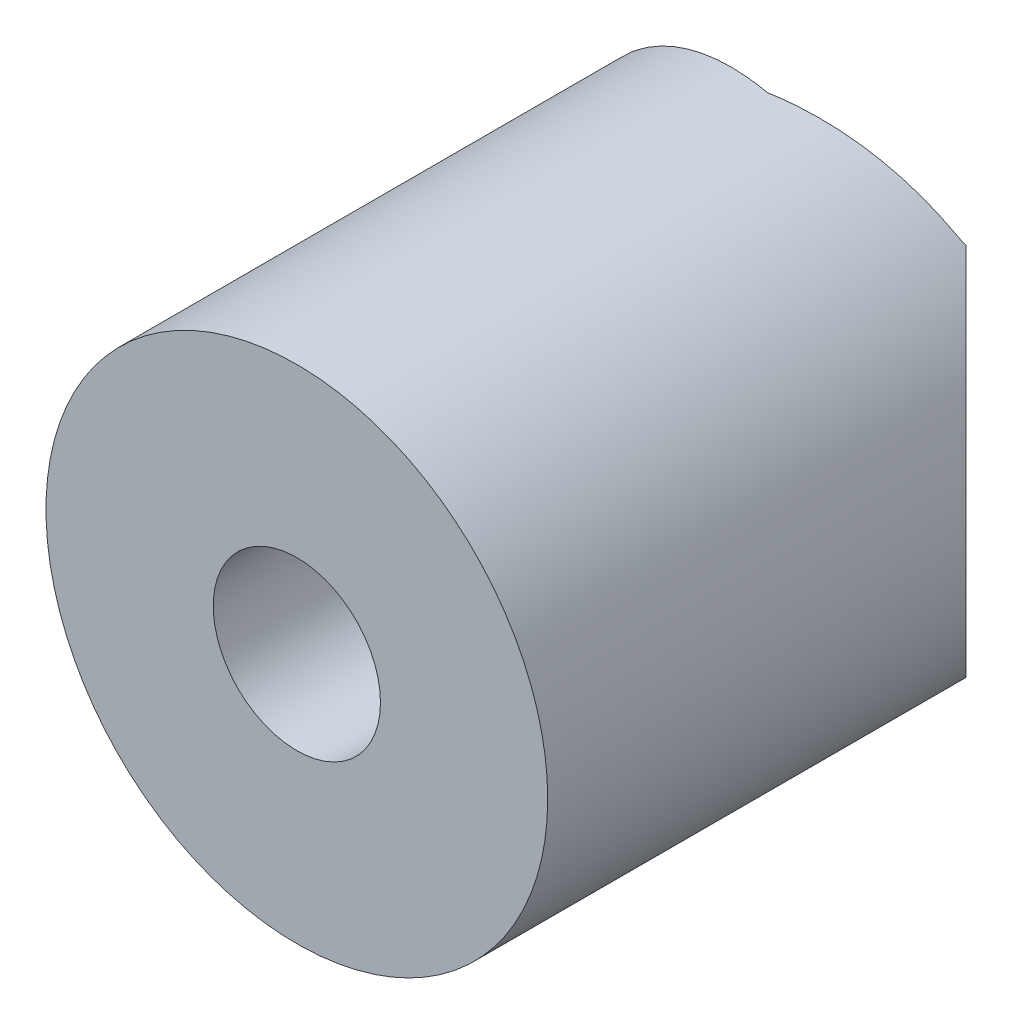
ISO-10303-21;
HEADER;
FILE_DESCRIPTION(('STEP AP214'),'2;1');
FILE_NAME('part.step','',(''),(''),'','','');
FILE_SCHEMA(('AUTOMOTIVE_DESIGN { 1 0 10303 214 1 1 1 1 }'));
ENDSEC;
DATA;
#1=APPLICATION_CONTEXT('core data for automotive mechanical design processes');
#2=APPLICATION_PROTOCOL_DEFINITION('international standard','automotive_design',2000,#1);
#3=PRODUCT_CONTEXT('',#1,'mechanical');
#4=PRODUCT('Part','Part','',(#3));
#5=PRODUCT_RELATED_PRODUCT_CATEGORY('part','',(#4));
#6=PRODUCT_DEFINITION_FORMATION('','',#4);
#7=PRODUCT_DEFINITION_CONTEXT('part definition',#1,'design');
#8=PRODUCT_DEFINITION('design','',#6,#7);
#9=PRODUCT_DEFINITION_SHAPE('','',#8);
#10=(LENGTH_UNIT() NAMED_UNIT(*) SI_UNIT(.MILLI.,.METRE.));
#11=(NAMED_UNIT(*) PLANE_ANGLE_UNIT() SI_UNIT($,.RADIAN.));
#12=(NAMED_UNIT(*) SI_UNIT($,.STERADIAN.) SOLID_ANGLE_UNIT());
#13=UNCERTAINTY_MEASURE_WITH_UNIT(LENGTH_MEASURE(1.E-05),#10,'distance_accuracy_value','');
#14=(GEOMETRIC_REPRESENTATION_CONTEXT(3) GLOBAL_UNCERTAINTY_ASSIGNED_CONTEXT((#13)) GLOBAL_UNIT_ASSIGNED_CONTEXT((#10,
#11,#12)) REPRESENTATION_CONTEXT('',''));
#15=CARTESIAN_POINT('',(0.,0.,0.));
#16=DIRECTION('',(0.,0.,1.));
#17=DIRECTION('',(1.,0.,0.));
#18=AXIS2_PLACEMENT_3D('',#15,#16,#17);
#19=CARTESIAN_POINT('',(0.,0.,-76.2));
#20=DIRECTION('',(0.,0.,1.));
#21=DIRECTION('',(1.,0.,0.));
#22=AXIS2_PLACEMENT_3D('',#19,#20,#21);
#23=CYLINDRICAL_SURFACE('',#22,38.1);
#24=CARTESIAN_POINT('',(24.3398214416335,29.3118251255257,-75.8835991586271));
#25=CARTESIAN_POINT('',(24.4311335789479,29.2360033599713,-75.9001381548973));
#26=CARTESIAN_POINT('',(24.5218196498711,29.1599773886905,-75.9191848617739));
#27=CARTESIAN_POINT('',(24.7016315526508,29.0078131129653,-75.9621877172523));
#28=CARTESIAN_POINT('',(24.7907599306828,28.9316752669905,-75.986134839524));
#29=CARTESIAN_POINT('',(24.9674825848449,28.7793055058739,-76.038893375985));
#30=CARTESIAN_POINT('',(25.0550768645508,28.7030735909518,-76.0677047788349));
#31=CARTESIAN_POINT('',(25.2287522518983,28.5505422731574,-76.1302057148872));
#32=CARTESIAN_POINT('',(25.3148302989751,28.474243001858,-76.1639040736765));
#33=CARTESIAN_POINT('',(25.4000000000001,28.3980633142472,-76.2));
#34=B_SPLINE_CURVE_WITH_KNOTS('',3,(#24,#25,#26,#27,#28,#29,#30,#31,#32,#33),.UNSPECIFIED.,.F.,
.F.,(4,2,2,2,4),(0.,0.359473855901179,0.718291443760455,1.07710819517633,1.43658121247219),.UNSPECIFIED.);
#35=CARTESIAN_POINT('',(24.3398214416335,29.3118251255257,-75.883599158627));
#36=VERTEX_POINT('',#35);
#37=CARTESIAN_POINT('',(25.4000000000001,28.3980633142472,-76.2));
#38=VERTEX_POINT('',#37);
#39=EDGE_CURVE('E203',#36,#38,#34,.T.);
#40=ORIENTED_EDGE('',*,*,#39,.F.);
#41=CARTESIAN_POINT('',(0.,0.,-71.4756));
#42=DIRECTION('',(0.178203572875659,0.,0.983993641551789));
#43=DIRECTION('',(-0.983993641551789,0.,0.178203572875659));
#44=AXIS2_PLACEMENT_3D('',#41,#42,#43);
#45=ELLIPSE('',#44,38.719762395939,38.1);
#46=CARTESIAN_POINT('',(0.,38.1,-71.4756));
#47=VERTEX_POINT('',#46);
#48=EDGE_CURVE('E194',#47,#36,#45,.F.);
#49=ORIENTED_EDGE('',*,*,#48,.F.);
#50=CARTESIAN_POINT('',(0.,0.,-71.4756));
#51=DIRECTION('',(0.178203572875659,0.,-0.983993641551789));
#52=DIRECTION('',(0.983993641551789,0.,0.178203572875659));
#53=AXIS2_PLACEMENT_3D('',#50,#51,#52);
#54=ELLIPSE('',#53,38.719762395939,38.1);
#55=CARTESIAN_POINT('',(-24.3398214416335,29.3118251255257,-75.883599158627));
#56=VERTEX_POINT('',#55);
#57=EDGE_CURVE('E182',#47,#56,#54,.F.);
#58=ORIENTED_EDGE('',*,*,#57,.T.);
#59=CARTESIAN_POINT('',(-24.3398214416335,29.3118251255257,-75.8835991586271));
#60=CARTESIAN_POINT('',(-24.4311335789479,29.2360033599713,-75.9001381548973));
#61=CARTESIAN_POINT('',(-24.5218196498711,29.1599773886905,-75.9191848617739));
#62=CARTESIAN_POINT('',(-24.7016315526508,29.0078131129653,-75.9621877172523));
#63=CARTESIAN_POINT('',(-24.7907599306828,28.9316752669906,-75.986134839524));
#64=CARTESIAN_POINT('',(-24.9674825848449,28.7793055058739,-76.038893375985));
#65=CARTESIAN_POINT('',(-25.0550768645508,28.7030735909518,-76.0677047788349));
#66=CARTESIAN_POINT('',(-25.2287522518983,28.5505422731574,-76.1302057148872));
#67=CARTESIAN_POINT('',(-25.3148302989751,28.474243001858,-76.1639040736765));
#68=CARTESIAN_POINT('',(-25.4000000000001,28.3980633142472,-76.2));
#69=B_SPLINE_CURVE_WITH_KNOTS('',3,(#59,#60,#61,#62,#63,#64,#65,#66,#67,#68),.UNSPECIFIED.,.F.,
.F.,(4,2,2,2,4),(0.,0.359473855901172,0.71829144376045,1.07710819517633,1.43658121247218),.UNSPECIFIED.);
#70=CARTESIAN_POINT('',(-25.4000000000001,28.3980633142472,-76.2));
#71=VERTEX_POINT('',#70);
#72=EDGE_CURVE('E325',#56,#71,#69,.T.);
#73=ORIENTED_EDGE('',*,*,#72,.T.);
#74=CARTESIAN_POINT('',(0.,0.,-101.6));
#75=DIRECTION('',(-0.707106781186552,0.,-0.707106781186544));
#76=DIRECTION('',(-0.707106781186544,0.,0.707106781186552));
#77=AXIS2_PLACEMENT_3D('',#74,#75,#76);
#78=ELLIPSE('',#77,53.8815367264152,38.1);
#79=CARTESIAN_POINT('',(-25.4000000000001,-28.3980633142472,-76.2));
#80=VERTEX_POINT('',#79);
#81=EDGE_CURVE('E207',#71,#80,#78,.F.);
#82=ORIENTED_EDGE('',*,*,#81,.T.);
#83=CARTESIAN_POINT('',(-25.4000000000002,-28.3980633142472,-76.2));
#84=CARTESIAN_POINT('',(-25.3148302989751,-28.474243001858,-76.1639040736765));
#85=CARTESIAN_POINT('',(-25.2287522518983,-28.5505422731574,-76.1302057148872));
#86=CARTESIAN_POINT('',(-25.0550768645508,-28.7030735909518,-76.0677047788349));
#87=CARTESIAN_POINT('',(-24.9674825848449,-28.7793055058739,-76.038893375985));
#88=CARTESIAN_POINT('',(-24.7907599306828,-28.9316752669905,-75.986134839524));
#89=CARTESIAN_POINT('',(-24.7016315526508,-29.0078131129653,-75.9621877172523));
#90=CARTESIAN_POINT('',(-24.5218196498711,-29.1599773886905,-75.9191848617739));
#91=CARTESIAN_POINT('',(-24.4311335789479,-29.2360033599713,-75.9001381548973));
#92=CARTESIAN_POINT('',(-24.3398214416335,-29.3118251255257,-75.8835991586271));
#93=B_SPLINE_CURVE_WITH_KNOTS('',3,(#83,#84,#85,#86,#87,#88,#89,#90,#91,#92),.UNSPECIFIED.,.F.,
.F.,(4,2,2,2,4),(0.,0.359473017295866,0.718289768711761,1.07710735657105,1.43658121247224),.UNSPECIFIED.);
#94=CARTESIAN_POINT('',(-24.3398214416335,-29.3118251255257,-75.883599158627));
#95=VERTEX_POINT('',#94);
#96=EDGE_CURVE('E152',#80,#95,#93,.T.);
#97=ORIENTED_EDGE('',*,*,#96,.T.);
#98=CARTESIAN_POINT('',(0.,-38.1,-71.4756));
#99=VERTEX_POINT('',#98);
#100=EDGE_CURVE('E189',#95,#99,#54,.F.);
#101=ORIENTED_EDGE('',*,*,#100,.T.);
#102=CARTESIAN_POINT('',(24.3398214416335,-29.3118251255257,-75.883599158627));
#103=VERTEX_POINT('',#102);
#104=EDGE_CURVE('E188',#103,#99,#45,.F.);
#105=ORIENTED_EDGE('',*,*,#104,.F.);
#106=CARTESIAN_POINT('',(25.4000000000002,-28.3980633142472,-76.2));
#107=CARTESIAN_POINT('',(25.3148302989751,-28.474243001858,-76.1639040736765));
#108=CARTESIAN_POINT('',(25.2287522518983,-28.5505422731574,-76.1302057148872));
#109=CARTESIAN_POINT('',(25.0550768645508,-28.7030735909518,-76.0677047788349));
#110=CARTESIAN_POINT('',(24.9674825848449,-28.7793055058739,-76.038893375985));
#111=CARTESIAN_POINT('',(24.7907599306828,-28.9316752669905,-75.986134839524));
#112=CARTESIAN_POINT('',(24.7016315526508,-29.0078131129653,-75.9621877172523));
#113=CARTESIAN_POINT('',(24.5218196498711,-29.1599773886905,-75.9191848617739));
#114=CARTESIAN_POINT('',(24.4311335789479,-29.2360033599713,-75.9001381548973));
#115=CARTESIAN_POINT('',(24.3398214416335,-29.3118251255257,-75.8835991586271));
#116=B_SPLINE_CURVE_WITH_KNOTS('',3,(#106,#107,#108,#109,#110,#111,#112,#113,#114,#115),
.UNSPECIFIED.,.F.,.F.,(4,2,2,2,4),(0.,0.359473017295866,0.718289768711761,1.07710735657105,
1.43658121247224),.UNSPECIFIED.);
#117=CARTESIAN_POINT('',(25.4000000000001,-28.3980633142472,-76.2));
#118=VERTEX_POINT('',#117);
#119=EDGE_CURVE('E319',#118,#103,#116,.T.);
#120=ORIENTED_EDGE('',*,*,#119,.F.);
#121=CARTESIAN_POINT('',(0.,0.,-101.6));
#122=DIRECTION('',(-0.707106781186552,0.,0.707106781186544));
#123=DIRECTION('',(0.707106781186544,0.,0.707106781186552));
#124=AXIS2_PLACEMENT_3D('',#121,#122,#123);
#125=ELLIPSE('',#124,53.8815367264152,38.1);
#126=EDGE_CURVE('E204',#38,#118,#125,.F.);
#127=ORIENTED_EDGE('',*,*,#126,.F.);
#128=EDGE_LOOP('',(#40,#49,#58,#73,#82,#97,#101,#105,#120,#127));
#129=FACE_BOUND('',#128,.T.);
#130=CARTESIAN_POINT('',(0.,0.,0.));
#131=DIRECTION('',(0.,0.,1.));
#132=DIRECTION('',(1.,0.,0.));
#133=AXIS2_PLACEMENT_3D('',#130,#131,#132);
#134=CIRCLE('',#133,38.1);
#135=CARTESIAN_POINT('',(38.1,0.,0.));
#136=VERTEX_POINT('',#135);
#137=EDGE_CURVE('E215',#136,#136,#134,.T.);
#138=ORIENTED_EDGE('',*,*,#137,.F.);
#139=EDGE_LOOP('',(#138));
#140=FACE_BOUND('',#139,.T.);
#141=ADVANCED_FACE('F129',(#129,#140),#23,.T.);
#142=CARTESIAN_POINT('',(0.,0.,0.));
#143=DIRECTION('',(0.,0.,1.));
#144=DIRECTION('',(1.,0.,0.));
#145=AXIS2_PLACEMENT_3D('',#142,#143,#144);
#146=PLANE('',#145);
#147=CARTESIAN_POINT('',(0.,0.,0.));
#148=DIRECTION('',(0.,0.,1.));
#149=DIRECTION('',(1.,0.,0.));
#150=AXIS2_PLACEMENT_3D('',#147,#148,#149);
#151=CIRCLE('',#150,12.7);
#152=CARTESIAN_POINT('',(12.7,0.,0.));
#153=VERTEX_POINT('',#152);
#154=EDGE_CURVE('E212',#153,#153,#151,.T.);
#155=ORIENTED_EDGE('',*,*,#154,.F.);
#156=EDGE_LOOP('',(#155));
#157=FACE_BOUND('',#156,.T.);
#158=ORIENTED_EDGE('',*,*,#137,.T.);
#159=EDGE_LOOP('',(#158));
#160=FACE_BOUND('',#159,.T.);
#161=ADVANCED_FACE('F231',(#157,#160),#146,.T.);
#162=CARTESIAN_POINT('',(0.,0.,-76.2));
#163=DIRECTION('',(0.,0.,1.));
#164=DIRECTION('',(1.,0.,0.));
#165=AXIS2_PLACEMENT_3D('',#162,#163,#164);
#166=CYLINDRICAL_SURFACE('',#165,12.7);
#167=CARTESIAN_POINT('',(0.,0.,-71.4756));
#168=DIRECTION('',(0.178203572875659,0.,-0.983993641551789));
#169=DIRECTION('',(0.983993641551789,0.,0.178203572875659));
#170=AXIS2_PLACEMENT_3D('',#167,#168,#169);
#171=ELLIPSE('',#170,12.906587465313,12.7);
#172=CARTESIAN_POINT('',(0.,12.7,-71.4756));
#173=VERTEX_POINT('',#172);
#174=CARTESIAN_POINT('',(0.,-12.7,-71.4756));
#175=VERTEX_POINT('',#174);
#176=EDGE_CURVE('E137',#173,#175,#171,.F.);
#177=ORIENTED_EDGE('',*,*,#176,.F.);
#178=CARTESIAN_POINT('',(0.,0.,-71.4756));
#179=DIRECTION('',(0.178203572875659,0.,0.983993641551789));
#180=DIRECTION('',(-0.983993641551789,0.,0.178203572875659));
#181=AXIS2_PLACEMENT_3D('',#178,#179,#180);
#182=ELLIPSE('',#181,12.906587465313,12.7);
#183=EDGE_CURVE('E12',#173,#175,#182,.F.);
#184=ORIENTED_EDGE('',*,*,#183,.T.);
#185=EDGE_LOOP('',(#177,#184));
#186=FACE_BOUND('',#185,.T.);
#187=ORIENTED_EDGE('',*,*,#154,.T.);
#188=EDGE_LOOP('',(#187));
#189=FACE_BOUND('',#188,.T.);
#190=ADVANCED_FACE('F227',(#186,#189),#166,.F.);
#191=CARTESIAN_POINT('',(50.8000000000002,-38.1,-50.7999999999996));
#192=DIRECTION('',(-0.707106781186552,0.,0.707106781186544));
#193=DIRECTION('',(0.707106781186544,0.,0.707106781186552));
#194=AXIS2_PLACEMENT_3D('',#191,#192,#193);
#195=PLANE('',#194);
#196=ORIENTED_EDGE('',*,*,#126,.T.);
#197=DIRECTION('',(0.,-1.,0.));
#198=VECTOR('',#197,1.);
#199=CARTESIAN_POINT('',(25.4000000000001,0.,-76.2));
#200=LINE('',#199,#198);
#201=EDGE_CURVE('E218',#38,#118,#200,.T.);
#202=ORIENTED_EDGE('',*,*,#201,.F.);
#203=EDGE_LOOP('',(#196,#202));
#204=FACE_BOUND('',#203,.T.);
#205=ADVANCED_FACE('F230',(#204),#195,.F.);
#206=CARTESIAN_POINT('',(-50.8000000000002,-38.1,-50.7999999999996));
#207=DIRECTION('',(-0.707106781186552,0.,-0.707106781186544));
#208=DIRECTION('',(-0.707106781186544,0.,0.707106781186552));
#209=AXIS2_PLACEMENT_3D('',#206,#207,#208);
#210=PLANE('',#209);
#211=ORIENTED_EDGE('',*,*,#81,.F.);
#212=DIRECTION('',(0.,-1.,0.));
#213=VECTOR('',#212,1.);
#214=CARTESIAN_POINT('',(-25.4000000000001,0.,-76.2));
#215=LINE('',#214,#213);
#216=EDGE_CURVE('E220',#71,#80,#215,.T.);
#217=ORIENTED_EDGE('',*,*,#216,.T.);
#218=EDGE_LOOP('',(#211,#217));
#219=FACE_BOUND('',#218,.T.);
#220=ADVANCED_FACE('F255',(#219),#210,.T.);
#221=CARTESIAN_POINT('',(-12.5333309878636,-38.1,-69.2057841518526));
#222=DIRECTION('',(0.178203572875659,0.,0.983993641551789));
#223=DIRECTION('',(0.983993641551789,0.,-0.178203572875659));
#224=AXIS2_PLACEMENT_3D('',#221,#222,#223);
#225=PLANE('',#224);
#226=ORIENTED_EDGE('',*,*,#48,.T.);
#227=DIRECTION('',(0.,1.,0.));
#228=VECTOR('',#227,1.);
#229=CARTESIAN_POINT('',(24.3398214416335,-38.1,-75.883599158627));
#230=LINE('',#229,#228);
#231=EDGE_CURVE('E226',#103,#36,#230,.T.);
#232=ORIENTED_EDGE('',*,*,#231,.F.);
#233=ORIENTED_EDGE('',*,*,#104,.T.);
#234=DIRECTION('',(0.,1.,0.));
#235=VECTOR('',#234,1.);
#236=CARTESIAN_POINT('',(0.,-38.1,-71.4756));
#237=LINE('',#236,#235);
#238=EDGE_CURVE('E198',#99,#175,#237,.T.);
#239=ORIENTED_EDGE('',*,*,#238,.T.);
#240=ORIENTED_EDGE('',*,*,#183,.F.);
#241=EDGE_CURVE('E144',#173,#47,#237,.T.);
#242=ORIENTED_EDGE('',*,*,#241,.T.);
#243=EDGE_LOOP('',(#226,#232,#233,#239,#240,#242));
#244=FACE_BOUND('',#243,.T.);
#245=ADVANCED_FACE('F192',(#244),#225,.F.);
#246=CARTESIAN_POINT('',(12.5333309878636,-38.1,-69.2057841518526));
#247=DIRECTION('',(0.178203572875659,0.,-0.983993641551789));
#248=DIRECTION('',(-0.983993641551789,0.,-0.178203572875659));
#249=AXIS2_PLACEMENT_3D('',#246,#247,#248);
#250=PLANE('',#249);
#251=ORIENTED_EDGE('',*,*,#241,.F.);
#252=ORIENTED_EDGE('',*,*,#176,.T.);
#253=ORIENTED_EDGE('',*,*,#238,.F.);
#254=ORIENTED_EDGE('',*,*,#100,.F.);
#255=DIRECTION('',(0.,1.,0.));
#256=VECTOR('',#255,1.);
#257=CARTESIAN_POINT('',(-24.3398214416335,-38.1,-75.883599158627));
#258=LINE('',#257,#256);
#259=EDGE_CURVE('E184',#95,#56,#258,.T.);
#260=ORIENTED_EDGE('',*,*,#259,.T.);
#261=ORIENTED_EDGE('',*,*,#57,.F.);
#262=EDGE_LOOP('',(#251,#252,#253,#254,#260,#261));
#263=FACE_BOUND('',#262,.T.);
#264=ADVANCED_FACE('F183',(#263),#250,.T.);
#265=CARTESIAN_POINT('',(-23.4488035940063,-38.1,-80.8035672738906));
#266=DIRECTION('',(0.,1.,0.));
#267=DIRECTION('',(0.,0.,1.));
#268=AXIS2_PLACEMENT_3D('',#265,#266,#267);
#269=CYLINDRICAL_SURFACE('',#268,4.99999990600002);
#270=ORIENTED_EDGE('',*,*,#216,.F.);
#271=ORIENTED_EDGE('',*,*,#72,.F.);
#272=ORIENTED_EDGE('',*,*,#259,.F.);
#273=ORIENTED_EDGE('',*,*,#96,.F.);
#274=EDGE_LOOP('',(#270,#271,#272,#273));
#275=FACE_BOUND('',#274,.T.);
#276=ADVANCED_FACE('F276',(#275),#269,.F.);
#277=CARTESIAN_POINT('',(23.4488035940063,-38.1,-80.8035672738906));
#278=DIRECTION('',(0.,1.,0.));
#279=DIRECTION('',(0.,0.,1.));
#280=AXIS2_PLACEMENT_3D('',#277,#278,#279);
#281=CYLINDRICAL_SURFACE('',#280,4.99999990600002);
#282=ORIENTED_EDGE('',*,*,#119,.T.);
#283=ORIENTED_EDGE('',*,*,#231,.T.);
#284=ORIENTED_EDGE('',*,*,#39,.T.);
#285=ORIENTED_EDGE('',*,*,#201,.T.);
#286=EDGE_LOOP('',(#282,#283,#284,#285));
#287=FACE_BOUND('',#286,.T.);
#288=ADVANCED_FACE('F283',(#287),#281,.F.);
#289=CLOSED_SHELL('',(#141,#161,#190,#205,#220,#245,#264,#276,#288));
#290=MANIFOLD_SOLID_BREP('B2',#289);
#291=ADVANCED_BREP_SHAPE_REPRESENTATION('',(#18,#290),#14);
#292=SHAPE_DEFINITION_REPRESENTATION(#9,#291);
ENDSEC;
END-ISO-10303-21;
